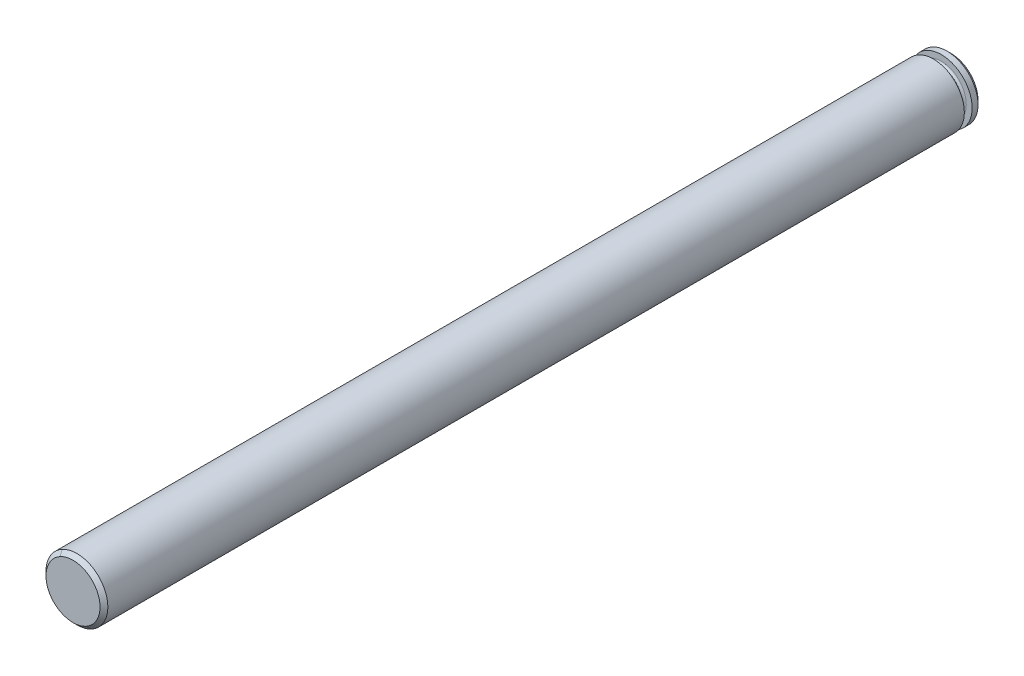
ISO-10303-21;
HEADER;
FILE_DESCRIPTION(('STEP AP214'),'2;1');
FILE_NAME('part.step','',(''),(''),'','','');
FILE_SCHEMA(('AUTOMOTIVE_DESIGN { 1 0 10303 214 1 1 1 1 }'));
ENDSEC;
DATA;
#1=APPLICATION_CONTEXT('core data for automotive mechanical design processes');
#2=APPLICATION_PROTOCOL_DEFINITION('international standard','automotive_design',2000,#1);
#3=PRODUCT_CONTEXT('',#1,'mechanical');
#4=PRODUCT('Part','Part','',(#3));
#5=PRODUCT_RELATED_PRODUCT_CATEGORY('part','',(#4));
#6=PRODUCT_DEFINITION_FORMATION('','',#4);
#7=PRODUCT_DEFINITION_CONTEXT('part definition',#1,'design');
#8=PRODUCT_DEFINITION('design','',#6,#7);
#9=PRODUCT_DEFINITION_SHAPE('','',#8);
#10=(LENGTH_UNIT() NAMED_UNIT(*) SI_UNIT(.MILLI.,.METRE.));
#11=(NAMED_UNIT(*) PLANE_ANGLE_UNIT() SI_UNIT($,.RADIAN.));
#12=(NAMED_UNIT(*) SI_UNIT($,.STERADIAN.) SOLID_ANGLE_UNIT());
#13=UNCERTAINTY_MEASURE_WITH_UNIT(LENGTH_MEASURE(1.E-05),#10,'distance_accuracy_value','');
#14=(GEOMETRIC_REPRESENTATION_CONTEXT(3) GLOBAL_UNCERTAINTY_ASSIGNED_CONTEXT((#13)) GLOBAL_UNIT_ASSIGNED_CONTEXT((#10,
#11,#12)) REPRESENTATION_CONTEXT('',''));
#15=CARTESIAN_POINT('',(0.,0.,0.));
#16=DIRECTION('',(0.,0.,1.));
#17=DIRECTION('',(1.,0.,0.));
#18=AXIS2_PLACEMENT_3D('',#15,#16,#17);
#19=CARTESIAN_POINT('',(0.,0.,0.));
#20=DIRECTION('',(0.,0.,1.));
#21=DIRECTION('',(1.,0.,0.));
#22=AXIS2_PLACEMENT_3D('',#19,#20,#21);
#23=PLANE('',#22);
#24=CARTESIAN_POINT('',(0.,-3.11706690820228E-13,-2.03114434993434E-12));
#25=DIRECTION('',(0.,1.56070185795301E-12,1.));
#26=DIRECTION('',(0.,-1.,1.56070185795301E-12));
#27=AXIS2_PLACEMENT_3D('',#24,#25,#26);
#28=CIRCLE('',#27,1.38499999999371);
#29=CARTESIAN_POINT('',(0.664003718670854,-1.21545220458804,0.));
#30=VERTEX_POINT('',#29);
#31=CARTESIAN_POINT('',(-0.664004370953871,1.21545184820934,-2.94373181587172E-11));
#32=VERTEX_POINT('',#31);
#33=EDGE_CURVE('E79',#30,#32,#28,.T.);
#34=ORIENTED_EDGE('',*,*,#33,.F.);
#35=CARTESIAN_POINT('',(0.,0.,0.));
#36=DIRECTION('',(0.,0.,1.));
#37=DIRECTION('',(1.,0.,0.));
#38=AXIS2_PLACEMENT_3D('',#35,#36,#37);
#39=CIRCLE('',#38,1.38500000003969);
#40=EDGE_CURVE('E68',#32,#30,#39,.T.);
#41=ORIENTED_EDGE('',*,*,#40,.F.);
#42=EDGE_LOOP('',(#34,#41));
#43=FACE_BOUND('',#42,.T.);
#44=ADVANCED_FACE('F16',(#43),#23,.F.);
#45=CARTESIAN_POINT('',(0.,0.,0.199999999892951));
#46=DIRECTION('',(0.,0.,1.));
#47=DIRECTION('',(1.,0.,0.));
#48=AXIS2_PLACEMENT_3D('',#45,#46,#47);
#49=CONICAL_SURFACE('',#48,1.58499999989036,0.785398163291734);
#50=CARTESIAN_POINT('',(0.759889478683472,-1.39096836059171,0.200000000063368));
#51=CARTESIAN_POINT('',(0.755894234761556,-1.38365518957146,0.191666666739275));
#52=CARTESIAN_POINT('',(0.75189899133004,-1.37634201829552,0.18333333340446));
#53=CARTESIAN_POINT('',(0.743908505448206,-1.3617156752076,0.166666666734832));
#54=CARTESIAN_POINT('',(0.739913262997888,-1.35440250339562,0.158333333400018));
#55=CARTESIAN_POINT('',(0.731922779065035,-1.3397761591857,0.141666666723012));
#56=CARTESIAN_POINT('',(0.727927537582499,-1.33246298678775,0.13333333338082));
#57=CARTESIAN_POINT('',(0.719937055610875,-1.31783664151221,0.116666666698712));
#58=CARTESIAN_POINT('',(0.715941815121786,-1.31052346863462,0.108333333358796));
#59=CARTESIAN_POINT('',(0.707951335126436,-1.29589712230343,0.0916666666956885));
#60=CARTESIAN_POINT('',(0.703956095620175,-1.28858394884984,0.083333333372498));
#61=CARTESIAN_POINT('',(0.695965617573733,-1.27395760142803,0.0666666666920793));
#62=CARTESIAN_POINT('',(0.691970379033551,-1.26664442745981,0.0583333333348512));
#63=CARTESIAN_POINT('',(0.68397990294874,-1.25201807897016,0.0416666666510874));
#64=CARTESIAN_POINT('',(0.67998466540411,-1.24470490444873,0.0333333333245516));
#65=CARTESIAN_POINT('',(0.671994191298251,-1.23007855488865,0.0166666666714801));
#66=CARTESIAN_POINT('',(0.667998954737021,-1.22276537985001,0.00833333334494439));
#67=CARTESIAN_POINT('',(0.664003718659898,-1.21545220456798,0.));
#68=B_SPLINE_CURVE_WITH_KNOTS('',3,(#50,#51,#52,#53,#54,#55,#56,#57,#58,#59,#60,#61,#62,#63,#64,
#65,#66,#67),.UNSPECIFIED.,.F.,.F.,(4,2,2,2,2,2,2,2,4),(0.,0.0353553390298724,0.07071067805974,
0.106066017211865,0.141421356241723,0.176776695308849,0.212132034423687,0.247487373490804,
0.282842712520643),.UNSPECIFIED.);
#69=CARTESIAN_POINT('',(0.759889478685623,-1.39096836059565,0.200000000015841));
#70=VERTEX_POINT('',#69);
#71=EDGE_CURVE('E73',#70,#30,#68,.T.);
#72=ORIENTED_EDGE('',*,*,#71,.F.);
#73=CARTESIAN_POINT('',(0.,0.,0.199999999999999));
#74=DIRECTION('',(0.,0.,1.));
#75=DIRECTION('',(1.,0.,0.));
#76=AXIS2_PLACEMENT_3D('',#73,#74,#75);
#77=CIRCLE('',#76,1.585);
#78=CARTESIAN_POINT('',(-0.759889478689931,1.39096836060383,0.20000000001587));
#79=VERTEX_POINT('',#78);
#80=EDGE_CURVE('E113',#79,#70,#77,.T.);
#81=ORIENTED_EDGE('',*,*,#80,.F.);
#82=DIRECTION('',(0.339005049431141,-0.620544580558992,-0.707106781185878));
#83=VECTOR('',#82,1.);
#84=CARTESIAN_POINT('',(-239234.007774535,437914.913830951,498999.999998572));
#85=LINE('',#84,#83);
#86=EDGE_CURVE('E76',#32,#79,#85,.F.);
#87=ORIENTED_EDGE('',*,*,#86,.F.);
#88=ORIENTED_EDGE('',*,*,#40,.T.);
#89=EDGE_LOOP('',(#72,#81,#87,#88));
#90=FACE_BOUND('',#89,.T.);
#91=ADVANCED_FACE('F71',(#90),#49,.T.);
#92=CARTESIAN_POINT('',(0.,0.,0.200000000061158));
#93=DIRECTION('',(0.,1.56070185795301E-12,1.));
#94=DIRECTION('',(0.,-1.,1.56070185795301E-12));
#95=AXIS2_PLACEMENT_3D('',#92,#93,#94);
#96=CONICAL_SURFACE('',#95,1.58499999999402,0.785398163240245);
#97=ORIENTED_EDGE('',*,*,#86,.T.);
#98=CARTESIAN_POINT('',(0.,0.,0.199999999999999));
#99=DIRECTION('',(0.,0.,1.));
#100=DIRECTION('',(1.,0.,0.));
#101=AXIS2_PLACEMENT_3D('',#98,#99,#100);
#102=CIRCLE('',#101,1.585);
#103=EDGE_CURVE('E85',#70,#79,#102,.T.);
#104=ORIENTED_EDGE('',*,*,#103,.F.);
#105=ORIENTED_EDGE('',*,*,#71,.T.);
#106=ORIENTED_EDGE('',*,*,#33,.T.);
#107=EDGE_LOOP('',(#97,#104,#105,#106));
#108=FACE_BOUND('',#107,.T.);
#109=ADVANCED_FACE('F83',(#108),#96,.T.);
#110=CARTESIAN_POINT('',(0.,0.,22.5));
#111=DIRECTION('',(0.,0.,1.));
#112=DIRECTION('',(1.,0.,0.));
#113=AXIS2_PLACEMENT_3D('',#110,#111,#112);
#114=CYLINDRICAL_SURFACE('',#113,1.585);
#115=CARTESIAN_POINT('',(0.,0.,0.5));
#116=DIRECTION('',(0.,0.,1.));
#117=DIRECTION('',(1.,0.,0.));
#118=AXIS2_PLACEMENT_3D('',#115,#116,#117);
#119=CIRCLE('',#118,1.585);
#120=CARTESIAN_POINT('',(1.585,0.,0.5));
#121=VERTEX_POINT('',#120);
#122=EDGE_CURVE('E116',#121,#121,#119,.T.);
#123=ORIENTED_EDGE('',*,*,#122,.F.);
#124=EDGE_LOOP('',(#123));
#125=FACE_BOUND('',#124,.T.);
#126=ORIENTED_EDGE('',*,*,#103,.T.);
#127=ORIENTED_EDGE('',*,*,#80,.T.);
#128=EDGE_LOOP('',(#126,#127));
#129=FACE_BOUND('',#128,.T.);
#130=ADVANCED_FACE('F105',(#125,#129),#114,.T.);
#131=CARTESIAN_POINT('',(0.,0.,0.5));
#132=DIRECTION('',(0.,0.,1.));
#133=DIRECTION('',(1.,0.,0.));
#134=AXIS2_PLACEMENT_3D('',#131,#132,#133);
#135=PLANE('',#134);
#136=CARTESIAN_POINT('',(1.285,0.,0.5));
#137=CARTESIAN_POINT('',(1.28498799707352,0.0147050297417649,0.500000001097084));
#138=CARTESIAN_POINT('',(1.28472756027749,0.0294098427772398,0.500000002221303));
#139=CARTESIAN_POINT('',(1.28371055856216,0.0588011581089547,0.500000003433274));
#140=CARTESIAN_POINT('',(1.28295403222613,0.0734876617402126,0.500000003521108));
#141=CARTESIAN_POINT('',(1.28094564720276,0.102825922414616,0.500000001570142));
#142=CARTESIAN_POINT('',(1.27969381724666,0.117477681423621,0.499999999531465));
#143=CARTESIAN_POINT('',(1.27669656751072,0.146729988725546,0.500000000601546));
#144=CARTESIAN_POINT('',(1.27495116660375,0.161330538954952,0.500000003710105));
#145=CARTESIAN_POINT('',(1.27096797454155,0.190464332830054,0.500000026378864));
#146=CARTESIAN_POINT('',(1.2687301924799,0.204997577713725,0.500000045938759));
#147=CARTESIAN_POINT('',(1.265008400323,0.226734315607106,0.500000105847074));
#148=CARTESIAN_POINT('',(1.26370692445435,0.233969496167106,0.500000130911946));
#149=CARTESIAN_POINT('',(1.26098284445311,0.248396287684475,0.500000187735406));
#150=CARTESIAN_POINT('',(1.25956058584783,0.25558796381526,0.50000021947526));
#151=CARTESIAN_POINT('',(1.25510290491829,0.277122433875555,0.500000306479361));
#152=CARTESIAN_POINT('',(1.25187632855789,0.291426131542391,0.500000353536226));
#153=CARTESIAN_POINT('',(1.24492164087692,0.319909057486411,0.50000040459447));
#154=CARTESIAN_POINT('',(1.24119358639828,0.334088299676714,0.500000408600725));
#155=CARTESIAN_POINT('',(1.23323758037846,0.36230346491391,0.500000371253394));
#156=CARTESIAN_POINT('',(1.22900970379884,0.376339409109974,0.500000329906602));
#157=CARTESIAN_POINT('',(1.22006916979096,0.404253538111248,0.500000220818375));
#158=CARTESIAN_POINT('',(1.21535660283347,0.418131751822809,0.500000153081859));
#159=CARTESIAN_POINT('',(1.20541837986792,0.445699326975706,0.500000047398954));
#160=CARTESIAN_POINT('',(1.20019283843829,0.459388729814437,0.50000000944593));
#161=CARTESIAN_POINT('',(1.19176936577519,0.480565316503003,0.499999994751669));
#162=CARTESIAN_POINT('',(1.18870231628079,0.4881053361269,0.499999998303808));
#163=CARTESIAN_POINT('',(1.17896525842148,0.511432830093821,0.500000004504551));
#164=CARTESIAN_POINT('',(1.17206033511395,0.527123450995526,0.500000001813609));
#165=CARTESIAN_POINT('',(1.15694901736774,0.559688028479315,0.500000025702216));
#166=CARTESIAN_POINT('',(1.14868129710778,0.576533480979396,0.500000055075333));
#167=CARTESIAN_POINT('',(1.12982843058922,0.612907447430353,0.500000147930819));
#168=CARTESIAN_POINT('',(1.1190965897236,0.632360297430498,0.50000021668838));
#169=CARTESIAN_POINT('',(1.1003428075993,0.664337327037302,0.500000320167498));
#170=CARTESIAN_POINT('',(1.09259854036268,0.677025166352065,0.500000358624801));
#171=CARTESIAN_POINT('',(1.08116782447637,0.695027333369588,0.500000392414278));
#172=CARTESIAN_POINT('',(1.07766151402148,0.700456467027864,0.500000399835571));
#173=CARTESIAN_POINT('',(1.06975072786448,0.712501063577201,0.500000410191192));
#174=CARTESIAN_POINT('',(1.06532495991501,0.719102544414565,0.500000411703123));
#175=CARTESIAN_POINT('',(1.05186367807091,0.738779684637734,0.500000408952618));
#176=CARTESIAN_POINT('',(1.04264325129584,0.751729524769693,0.500000397405825));
#177=CARTESIAN_POINT('',(1.0237237971286,0.777272238566719,0.500000354502346));
#178=CARTESIAN_POINT('',(1.01402481890427,0.789865148695417,0.500000323147692));
#179=CARTESIAN_POINT('',(0.994160925856835,0.814675475925264,0.500000249669426));
#180=CARTESIAN_POINT('',(0.983996066984227,0.826892937823449,0.500000207547105));
#181=CARTESIAN_POINT('',(0.963219815835392,0.850939444749202,0.50000012373105));
#182=CARTESIAN_POINT('',(0.952608484941941,0.862768542775068,0.500000082037258));
#183=CARTESIAN_POINT('',(0.930936971665197,0.886004602354071,0.500000022478194));
#184=CARTESIAN_POINT('',(0.919876858789827,0.897411628758916,0.500000004609247));
#185=CARTESIAN_POINT('',(0.902287474192605,0.914963377768376,0.499999997399253));
#186=CARTESIAN_POINT('',(0.895883984541143,0.921235183839417,0.499999999020036));
#187=CARTESIAN_POINT('',(0.877139810123166,0.939229941536692,0.500000002114661));
#188=CARTESIAN_POINT('',(0.864636695142938,0.950784800500011,0.500000002146594));
#189=CARTESIAN_POINT('',(0.838409502858379,0.974077560857547,0.500000027490383));
#190=CARTESIAN_POINT('',(0.82465738859823,0.985783966924233,0.500000054337281));
#191=CARTESIAN_POINT('',(0.806971293272475,1.00020980864941,0.500000105957419));
#192=CARTESIAN_POINT('',(0.803258954371275,1.00320366753588,0.500000117720039));
#193=CARTESIAN_POINT('',(0.785883097071961,1.01705617972917,0.500000174734945));
#194=CARTESIAN_POINT('',(0.772011251181357,1.02765612949908,0.500000225857636));
#195=CARTESIAN_POINT('',(0.74593901159483,1.04674092849131,0.500000314262464));
#196=CARTESIAN_POINT('',(0.733797018630423,1.05530581914133,0.500000352472163));
#197=CARTESIAN_POINT('',(0.71616821861681,1.06727873643727,0.500000385927777));
#198=CARTESIAN_POINT('',(0.71080114934286,1.07086377428436,0.50000039325061));
#199=CARTESIAN_POINT('',(0.698764503312622,1.07877083089389,0.500000403504732));
#200=CARTESIAN_POINT('',(0.692080868958041,1.08307145572291,0.500000405027989));
#201=CARTESIAN_POINT('',(0.671911693256627,1.09578348448883,0.500000402410339));
#202=CARTESIAN_POINT('',(0.658306445664472,1.10400602325343,0.500000391083914));
#203=CARTESIAN_POINT('',(0.630798385728783,1.1199331872925,0.500000348981055));
#204=CARTESIAN_POINT('',(0.61689560360253,1.12763786483438,0.500000318206588));
#205=CARTESIAN_POINT('',(0.588812000251104,1.14251866430475,0.500000245749123));
#206=CARTESIAN_POINT('',(0.574631212089149,1.14969484860977,0.500000204067416));
#207=CARTESIAN_POINT('',(0.546012476457049,1.16350955026776,0.500000122155963));
#208=CARTESIAN_POINT('',(0.53157456405419,1.17014814026451,0.50000008192602));
#209=CARTESIAN_POINT('',(0.502460501679691,1.18287428152431,0.500000021012117));
#210=CARTESIAN_POINT('',(0.48778438837333,1.18896191666248,0.500000000325176));
#211=CARTESIAN_POINT('',(0.459322608293963,1.20015982313465,0.4999999996991));
#212=CARTESIAN_POINT('',(0.445552259893445,1.20530913088757,0.500000016833255));
#213=CARTESIAN_POINT('',(0.417852372091183,1.21515070985214,0.500000044735234));
#214=CARTESIAN_POINT('',(0.403922866072238,1.21984307500886,0.500000055504369));
#215=CARTESIAN_POINT('',(0.375917914392371,1.22876153525919,0.500000055659529));
#216=CARTESIAN_POINT('',(0.361842493133755,1.23298770698374,0.500000045049074));
#217=CARTESIAN_POINT('',(0.333561596748888,1.24097298563415,0.500000020401565));
#218=CARTESIAN_POINT('',(0.319356137860121,1.24473215004245,0.500000006364934));
#219=CARTESIAN_POINT('',(0.290828042958565,1.25177044867789,0.499999993872397));
#220=CARTESIAN_POINT('',(0.276505416625777,1.25504962214577,0.499999995415217));
#221=CARTESIAN_POINT('',(0.254950385404767,1.2596309695535,0.500000115148755));
#222=CARTESIAN_POINT('',(0.247753530661562,1.26110184911905,0.500000174629749));
#223=CARTESIAN_POINT('',(0.237831885132774,1.26301840536092,0.500000225576079));
#224=CARTESIAN_POINT('',(0.235120035591347,1.26353086297671,0.500000236321019));
#225=CARTESIAN_POINT('',(0.221022659694485,1.26614042657237,0.500000275518583));
#226=CARTESIAN_POINT('',(0.209606038756417,1.26806956265281,0.500000250870432));
#227=CARTESIAN_POINT('',(0.178743531471963,1.27285720160833,0.500000189827051));
#228=CARTESIAN_POINT('',(0.159251578261061,1.27542538135917,0.500000157229964));
#229=CARTESIAN_POINT('',(0.133573545870706,1.27820411908283,0.500000111761689));
#230=CARTESIAN_POINT('',(0.127429433155902,1.27882369413722,0.500000100692938));
#231=CARTESIAN_POINT('',(0.104590990899455,1.28096060739732,0.50000006294544));
#232=CARTESIAN_POINT('',(0.0878691011349143,1.28219590114673,0.500000042040274));
#233=CARTESIAN_POINT('',(0.0554771002968265,1.28395311962118,0.500000013724783));
#234=CARTESIAN_POINT('',(0.0398091850313694,1.2845161505283,0.500000005526469));
#235=CARTESIAN_POINT('',(0.0160921040422124,1.28493727607514,0.500000000543382));
#236=CARTESIAN_POINT('',(0.00804612832851601,1.28500509148009,0.500000000145688));
#237=CARTESIAN_POINT('',(-0.0146963837234354,1.28499070032914,0.499999999733898));
#238=CARTESIAN_POINT('',(-0.029393276594543,1.28473817152102,0.500000000308526));
#239=CARTESIAN_POINT('',(-0.0587687697318173,1.28373286110426,0.500000000359284));
#240=CARTESIAN_POINT('',(-0.0734473710772349,1.28298011056099,0.499999999835483));
#241=CARTESIAN_POINT('',(-0.102770132257111,1.28097903324434,0.500000000309181));
#242=CARTESIAN_POINT('',(-0.117414293651919,1.27973072937542,0.500000001306611));
#243=CARTESIAN_POINT('',(-0.146651454388751,1.27673922177249,0.500000011600579));
#244=CARTESIAN_POINT('',(-0.161244455269162,1.27499603305105,0.500000020896866));
#245=CARTESIAN_POINT('',(-0.190363104823107,1.27101630469696,0.500000056890947));
#246=CARTESIAN_POINT('',(-0.204888754466916,1.2687797721942,0.500000083588491));
#247=CARTESIAN_POINT('',(-0.226613920533461,1.26505890435128,0.500000151687464));
#248=CARTESIAN_POINT('',(-0.233845216717645,1.263757577668,0.500000179063286));
#249=CARTESIAN_POINT('',(-0.24827244429538,1.26103224222896,0.500000238601334));
#250=CARTESIAN_POINT('',(-0.255468414160564,1.25960843733242,0.500000270755667));
#251=CARTESIAN_POINT('',(-0.277015529133428,1.25514618140374,0.500000356644486));
#252=CARTESIAN_POINT('',(-0.29132756543794,1.25191660192182,0.500000399814742));
#253=CARTESIAN_POINT('',(-0.319826809824331,1.244955806271,0.500000441162701));
#254=CARTESIAN_POINT('',(-0.334014034253897,1.24122465687149,0.500000439346389));
#255=CARTESIAN_POINT('',(-0.362244835909076,1.23326243503202,0.500000391109541));
#256=CARTESIAN_POINT('',(-0.37628843693921,1.22903144694503,0.500000344696523));
#257=CARTESIAN_POINT('',(-0.404217588771221,1.22008470769989,0.500000227653526));
#258=CARTESIAN_POINT('',(-0.418103171238583,1.215369055634,0.50000015702849));
#259=CARTESIAN_POINT('',(-0.445685160698457,1.20542455846413,0.500000047982143));
#260=CARTESIAN_POINT('',(-0.459381612217362,1.20019583658372,0.50000000955312));
#261=CARTESIAN_POINT('',(-0.4805580059167,1.19177218110158,0.499999994700014));
#262=CARTESIAN_POINT('',(-0.488090806362517,1.18870817693157,0.499999998287832));
#263=CARTESIAN_POINT('',(-0.511412295003634,1.17897416960181,0.500000004552065));
#264=CARTESIAN_POINT('',(-0.527104051177037,1.17206904478797,0.500000001817467));
#265=CARTESIAN_POINT('',(-0.559675966420853,1.1569549267687,0.500000025665269));
#266=CARTESIAN_POINT('',(-0.576527518709203,1.14868438433371,0.500000055055581));
#267=CARTESIAN_POINT('',(-0.612907449454256,1.12982843315874,0.500000147936186));
#268=CARTESIAN_POINT('',(-0.632360297950585,1.11909659021359,0.500000216689513));
#269=CARTESIAN_POINT('',(-0.664337326890402,1.10034280715302,0.50000032016674));
#270=CARTESIAN_POINT('',(-0.677025166415407,1.09259854023377,0.500000358624674));
#271=CARTESIAN_POINT('',(-0.69502733344989,1.08116782446387,0.500000392414333));
#272=CARTESIAN_POINT('',(-0.700456467063945,1.07766151400756,0.500000399835586));
#273=CARTESIAN_POINT('',(-0.712501063569344,1.06975072785761,0.500000410191173));
#274=CARTESIAN_POINT('',(-0.719102544410697,1.06532495992376,0.500000411703121));
#275=CARTESIAN_POINT('',(-0.738779684645431,1.05186367805343,0.500000408952621));
#276=CARTESIAN_POINT('',(-0.751729524784562,1.04264325116338,0.500000397405763));
#277=CARTESIAN_POINT('',(-0.777272238551843,1.02372379726107,0.500000354502407));
#278=CARTESIAN_POINT('',(-0.78986514864363,1.01402481941658,0.50000032314794));
#279=CARTESIAN_POINT('',(-0.814675475977047,0.994160925344602,0.500000249669178));
#280=CARTESIAN_POINT('',(-0.826892938015693,0.983996065067809,0.500000207546173));
#281=CARTESIAN_POINT('',(-0.850939444556992,0.963219817751568,0.500000123731981));
#282=CARTESIAN_POINT('',(-0.862768542058034,0.952608492093986,0.500000082040735));
#283=CARTESIAN_POINT('',(-0.886004603071002,0.930936964514267,0.500000022474718));
#284=CARTESIAN_POINT('',(-0.897411631434253,0.919876832103874,0.500000004596273));
#285=CARTESIAN_POINT('',(-0.914963376257843,0.90228748925102,0.499999997406574));
#286=CARTESIAN_POINT('',(-0.921235179343113,0.895884029373497,0.499999999041831));
#287=CARTESIAN_POINT('',(-0.939229950068604,0.877139724994844,0.500000002073273));
#288=CARTESIAN_POINT('',(-0.950784844537082,0.864636255858907,0.500000001933027));
#289=CARTESIAN_POINT('',(-0.974077514142019,0.838409968823384,0.500000027716919));
#290=CARTESIAN_POINT('',(-0.985783783996664,0.824659213259777,0.500000055224371));
#291=CARTESIAN_POINT('',(-1.01124048652332,0.79344570224752,0.500000144335991));
#292=CARTESIAN_POINT('',(-1.02483920835345,0.775858643653458,0.500000212343926));
#293=CARTESIAN_POINT('',(-1.04674126688915,0.745939135411321,0.500000314575005));
#294=CARTESIAN_POINT('',(-1.05530587632213,0.733797039578453,0.500000352525011));
#295=CARTESIAN_POINT('',(-1.06727871157721,0.716168209542161,0.500000385904817));
#296=CARTESIAN_POINT('',(-1.07086376686238,0.71080114663796,0.500000393243731));
#297=CARTESIAN_POINT('',(-1.07877084002708,0.698764506652462,0.500000403513202));
#298=CARTESIAN_POINT('',(-1.08307145880248,0.692080870080987,0.500000405030975));
#299=CARTESIAN_POINT('',(-1.09578347833052,0.671911691011117,0.500000402404368));
#300=CARTESIAN_POINT('',(-1.10400602283056,0.658306445548428,0.500000391081963));
#301=CARTESIAN_POINT('',(-1.11993318771561,0.630798385844956,0.500000348983007));
#302=CARTESIAN_POINT('',(-1.12763786036913,0.616895601821862,0.500000318208422));
#303=CARTESIAN_POINT('',(-1.14251866876985,0.588812002031709,0.500000245747289));
#304=CARTESIAN_POINT('',(-1.14969486689138,0.574631219326996,0.500000204062031));
#305=CARTESIAN_POINT('',(-1.16350953198897,0.5460124692203,0.500000122161347));
#306=CARTESIAN_POINT('',(-1.17014807161749,0.53157453688904,0.500000081945724));
#307=CARTESIAN_POINT('',(-1.18287435016109,0.502460528840765,0.500000020992416));
#308=CARTESIAN_POINT('',(-1.188962172915,0.487784489774668,0.500000000251761));
#309=CARTESIAN_POINT('',(-1.20014972295959,0.459347584714749,0.49999999976746));
#310=CARTESIAN_POINT('',(-1.20528940347673,0.445602397074759,0.500000017014584));
#311=CARTESIAN_POINT('',(-1.21511197254482,0.417951876164128,0.500000048365985));
#312=CARTESIAN_POINT('',(-1.21979492429396,0.404046565348515,0.500000062470699));
#313=CARTESIAN_POINT('',(-1.2286948216725,0.376089183541786,0.500000070682661));
#314=CARTESIAN_POINT('',(-1.23291181451615,0.362037127578148,0.500000064791938));
#315=CARTESIAN_POINT('',(-1.24087932147218,0.333802269502494,0.500000042534345));
#316=CARTESIAN_POINT('',(-1.24462986554729,0.319619475851454,0.500000026168148));
#317=CARTESIAN_POINT('',(-1.2516494824195,0.291135727979141,0.499999994513787));
#318=CARTESIAN_POINT('',(-1.25491856827098,0.276834776972725,0.499999979225594));
#319=CARTESIAN_POINT('',(-1.25948897805758,0.255312871805513,0.500000036469864));
#320=CARTESIAN_POINT('',(-1.26095693575592,0.248127022311248,0.500000068915401));
#321=CARTESIAN_POINT('',(-1.26275602672824,0.238780858021017,0.500000086737727));
#322=CARTESIAN_POINT('',(-1.26316159442588,0.236634933863604,0.500000089167814));
#323=CARTESIAN_POINT('',(-1.26561013626145,0.223475751286302,0.50000009874565));
#324=CARTESIAN_POINT('',(-1.26749963882529,0.212434074180855,0.500000083943431));
#325=CARTESIAN_POINT('',(-1.2734219549845,0.174883864753684,0.500000040886966));
#326=CARTESIAN_POINT('',(-1.27677242109831,0.148263148622219,0.500000022630324));
#327=CARTESIAN_POINT('',(-1.28059086794663,0.107697613592006,0.500000006075712));
#328=CARTESIAN_POINT('',(-1.28167037072618,0.0938065278449376,0.500000002403016));
#329=CARTESIAN_POINT('',(-1.28346219638524,0.0646959263578179,0.499999999082603));
#330=CARTESIAN_POINT('',(-1.28413075448808,0.0494736332222034,0.499999999843297));
#331=CARTESIAN_POINT('',(-1.28483800434566,0.02283208447089,0.500000000760982));
#332=CARTESIAN_POINT('',(-1.28499255798055,0.0114157929006724,0.500000001021491));
#333=CARTESIAN_POINT('',(-1.285,0.,0.5));
#334=B_SPLINE_CURVE_WITH_KNOTS('',3,(#136,#137,#138,#139,#140,#141,#142,#143,#144,#145,#146,
#147,#148,#149,#150,#151,#152,#153,#154,#155,#156,#157,#158,#159,#160,#161,#162,#163,#164,#165,
#166,#167,#168,#169,#170,#171,#172,#173,#174,#175,#176,#177,#178,#179,#180,#181,#182,#183,#184,
#185,#186,#187,#188,#189,#190,#191,#192,#193,#194,#195,#196,#197,#198,#199,#200,#201,#202,#203,
#204,#205,#206,#207,#208,#209,#210,#211,#212,#213,#214,#215,#216,#217,#218,#219,#220,#221,#222,
#223,#224,#225,#226,#227,#228,#229,#230,#231,#232,#233,#234,#235,#236,#237,#238,#239,#240,#241,
#242,#243,#244,#245,#246,#247,#248,#249,#250,#251,#252,#253,#254,#255,#256,#257,#258,#259,#260,
#261,#262,#263,#264,#265,#266,#267,#268,#269,#270,#271,#272,#273,#274,#275,#276,#277,#278,#279,
#280,#281,#282,#283,#284,#285,#286,#287,#288,#289,#290,#291,#292,#293,#294,#295,#296,#297,#298,
#299,#300,#301,#302,#303,#304,#305,#306,#307,#308,#309,#310,#311,#312,#313,#314,#315,#316,#317,
#318,#319,#320,#321,#322,#323,#324,#325,#326,#327,#328,#329,#330,#331,#332,#333),.UNSPECIFIED.,
.F.,.F.,(4,2,2,2,2,2,2,2,2,2,2,2,2,2,2,2,2,2,2,2,2,2,2,2,2,2,2,2,2,2,2,2,2,2,2,2,2,2,2,2,2,2,2,
2,2,2,2,2,2,2,2,2,2,2,2,2,2,2,2,2,2,2,2,2,2,2,2,2,2,2,2,2,2,2,2,2,2,2,2,2,2,2,2,2,2,2,2,2,2,2,2,
2,2,2,2,2,2,2,4),(0.,0.0441129853350718,0.0882225401989148,0.132329536759885,0.176434847011096,
0.220539342768247,0.242592342744173,0.264584253177065,0.308563627261506,0.352538020531854,
0.396505827024598,0.440465441470086,0.484415259301787,0.508834577110349,0.560248084026298,
0.616526165604483,0.68314382958301,0.727728345521007,0.747116512571211,0.770958577992412,
0.818637452866892,0.866311439227278,0.913979715049596,0.961641458523542,1.00929584805422,
1.03618461998408,1.08724544045702,1.14140700208517,1.15571436930153,1.20807171678635,
1.25263892662141,1.2720011475095,1.29584309384371,1.34352177924415,1.3911956452148,
1.43886387532842,1.48652565336673,1.53418016332215,1.57827705283129,1.62236485701845,
1.6664454034025,1.71052051866469,1.75459202863394,1.77662775751291,1.78490720032038,
1.81963819526367,1.87859444759792,1.89712004977135,1.94740798044393,1.99443116937202,
2.01856898324272,2.0626570912625,2.106742461525,2.15082579440118,2.19490779013077,
2.23898914882072,2.26103059698572,2.2830360429314,2.32704180741983,2.37104171961488,
2.41503421694574,2.45901773759028,2.50299072048376,2.52738653892047,2.57880340092469,
2.63510162143665,2.7017192855929,2.74630380145979,2.76569196840331,2.78953403382452,
2.837212908699,2.88488689505939,2.93255517088171,2.98021691435566,3.02787130388634,
3.05476007581202,3.10582089628554,3.15998245791727,3.22664332363936,3.27121053349205,
3.2905727544066,3.31441470074084,3.3620933861413,3.40976725211197,3.45743548222559,
3.50509726026391,3.55275177021931,3.59676784205199,3.64077781465348,3.68478332375451,
3.72878600466229,3.77278749225065,3.79478905665089,3.80134074187228,3.83494412366736,
3.91537312384318,3.95716656001583,4.00286740138245,4.03711513705482),.UNSPECIFIED.);
#335=CARTESIAN_POINT('',(-1.285,0.,0.5));
#336=VERTEX_POINT('',#335);
#337=CARTESIAN_POINT('',(1.285,0.,0.5));
#338=VERTEX_POINT('',#337);
#339=EDGE_CURVE('E119',#336,#338,#334,.F.);
#340=ORIENTED_EDGE('',*,*,#339,.T.);
#341=CARTESIAN_POINT('',(0.,0.,0.5));
#342=DIRECTION('',(0.,0.,1.));
#343=DIRECTION('',(-1.,0.,0.));
#344=AXIS2_PLACEMENT_3D('',#341,#342,#343);
#345=CIRCLE('',#344,1.285);
#346=EDGE_CURVE('E123',#338,#336,#345,.F.);
#347=ORIENTED_EDGE('',*,*,#346,.T.);
#348=EDGE_LOOP('',(#340,#347));
#349=FACE_BOUND('',#348,.T.);
#350=ORIENTED_EDGE('',*,*,#122,.T.);
#351=EDGE_LOOP('',(#350));
#352=FACE_BOUND('',#351,.T.);
#353=ADVANCED_FACE('F178',(#349,#352),#135,.T.);
#354=CARTESIAN_POINT('',(0.,0.,0.6));
#355=DIRECTION('',(0.,0.,1.));
#356=DIRECTION('',(-1.,0.,0.));
#357=AXIS2_PLACEMENT_3D('',#354,#355,#356);
#358=TOROIDAL_SURFACE('',#357,1.285,0.1);
#359=ORIENTED_EDGE('',*,*,#346,.F.);
#360=ORIENTED_EDGE('',*,*,#339,.F.);
#361=EDGE_LOOP('',(#359,#360));
#362=FACE_BOUND('',#361,.T.);
#363=CARTESIAN_POINT('',(0.,0.,0.6));
#364=DIRECTION('',(0.,0.,1.));
#365=DIRECTION('',(1.,0.,0.));
#366=AXIS2_PLACEMENT_3D('',#363,#364,#365);
#367=CIRCLE('',#366,1.185);
#368=CARTESIAN_POINT('',(1.185,0.,0.6));
#369=VERTEX_POINT('',#368);
#370=EDGE_CURVE('E171',#369,#369,#367,.T.);
#371=ORIENTED_EDGE('',*,*,#370,.F.);
#372=EDGE_LOOP('',(#371));
#373=FACE_BOUND('',#372,.T.);
#374=ADVANCED_FACE('F175',(#362,#373),#358,.F.);
#375=CARTESIAN_POINT('',(0.,0.,0.7));
#376=DIRECTION('',(0.,0.,1.));
#377=DIRECTION('',(1.,0.,0.));
#378=AXIS2_PLACEMENT_3D('',#375,#376,#377);
#379=CYLINDRICAL_SURFACE('',#378,1.185);
#380=CARTESIAN_POINT('',(0.,0.,0.8));
#381=DIRECTION('',(0.,0.,1.));
#382=DIRECTION('',(-1.,0.,0.));
#383=AXIS2_PLACEMENT_3D('',#380,#381,#382);
#384=CIRCLE('',#383,1.185);
#385=CARTESIAN_POINT('',(-1.185,0.,0.8));
#386=VERTEX_POINT('',#385);
#387=EDGE_CURVE('E163',#386,#386,#384,.F.);
#388=ORIENTED_EDGE('',*,*,#387,.T.);
#389=EDGE_LOOP('',(#388));
#390=FACE_BOUND('',#389,.T.);
#391=ORIENTED_EDGE('',*,*,#370,.T.);
#392=EDGE_LOOP('',(#391));
#393=FACE_BOUND('',#392,.T.);
#394=ADVANCED_FACE('F149',(#390,#393),#379,.T.);
#395=CARTESIAN_POINT('',(0.,0.,0.8));
#396=DIRECTION('',(0.,0.,1.));
#397=DIRECTION('',(-1.,0.,0.));
#398=AXIS2_PLACEMENT_3D('',#395,#396,#397);
#399=TOROIDAL_SURFACE('',#398,1.285,0.1);
#400=ORIENTED_EDGE('',*,*,#387,.F.);
#401=EDGE_LOOP('',(#400));
#402=FACE_BOUND('',#401,.T.);
#403=CARTESIAN_POINT('',(0.,0.,0.9));
#404=DIRECTION('',(0.,0.,-1.));
#405=DIRECTION('',(1.,0.,0.));
#406=AXIS2_PLACEMENT_3D('',#403,#404,#405);
#407=CIRCLE('',#406,1.285);
#408=CARTESIAN_POINT('',(1.285,0.,0.9));
#409=VERTEX_POINT('',#408);
#410=CARTESIAN_POINT('',(-1.285,0.,0.9));
#411=VERTEX_POINT('',#410);
#412=EDGE_CURVE('E159',#409,#411,#407,.T.);
#413=ORIENTED_EDGE('',*,*,#412,.T.);
#414=CARTESIAN_POINT('',(-1.285,0.,0.9));
#415=CARTESIAN_POINT('',(-1.28498604396833,0.0179374024178484,0.899999997869807));
#416=CARTESIAN_POINT('',(-1.28459958677738,0.0358742136803566,0.899999996242543));
#417=CARTESIAN_POINT('',(-1.28308523096232,0.0717156061434968,0.899999994121383));
#418=CARTESIAN_POINT('',(-1.28195737026677,0.0896201889458838,0.899999993627428));
#419=CARTESIAN_POINT('',(-1.27896381119708,0.125367380439808,0.899999993900144));
#420=CARTESIAN_POINT('',(-1.27709813501605,0.143209990979155,0.899999994666776));
#421=CARTESIAN_POINT('',(-1.27262292667927,0.178800398971072,0.900000003688988));
#422=CARTESIAN_POINT('',(-1.27001340121879,0.196548197275566,0.900000011944499));
#423=CARTESIAN_POINT('',(-1.26366732337729,0.234455996503967,0.899999972122882));
#424=CARTESIAN_POINT('',(-1.25982302618235,0.254598421602253,0.899999915830277));
#425=CARTESIAN_POINT('',(-1.2542895894924,0.279879306100922,0.899999922648013));
#426=CARTESIAN_POINT('',(-1.25310152335335,0.285129419572956,0.899999928321085));
#427=CARTESIAN_POINT('',(-1.24760358094472,0.308740870650165,0.899999951649884));
#428=CARTESIAN_POINT('',(-1.24292514838406,0.327017855150343,0.899999963744218));
#429=CARTESIAN_POINT('',(-1.23198177797785,0.366146321277845,0.899999985462533));
#430=CARTESIAN_POINT('',(-1.22558346790872,0.386960732009777,0.899999994419074));
#431=CARTESIAN_POINT('',(-1.21700592982508,0.412545160031495,0.899999998562896));
#432=CARTESIAN_POINT('',(-1.21531712497266,0.417482939735337,0.899999999041552));
#433=CARTESIAN_POINT('',(-1.20748437570827,0.439948035007361,0.900000000642207));
#434=CARTESIAN_POINT('',(-1.20099855277134,0.45735787286153,0.900000000276177));
#435=CARTESIAN_POINT('',(-1.18711546527519,0.49233331972838,0.899999998746928));
#436=CARTESIAN_POINT('',(-1.17969894947436,0.50989129014769,0.899999997563314));
#437=CARTESIAN_POINT('',(-1.16964194731961,0.532326968787123,0.899999976052124));
#438=CARTESIAN_POINT('',(-1.16734697162724,0.537361318103889,0.899999969905551));
#439=CARTESIAN_POINT('',(-1.15918467643568,0.554963883401433,0.899999944341165));
#440=CARTESIAN_POINT('',(-1.15314556085857,0.56745301336142,0.899999918882328));
#441=CARTESIAN_POINT('',(-1.13816413861504,0.597181792370884,0.899999855897632));
#442=CARTESIAN_POINT('',(-1.12902679197796,0.614323448135574,0.899999817618282));
#443=CARTESIAN_POINT('',(-1.10997729028716,0.648170830376749,0.899999752701668));
#444=CARTESIAN_POINT('',(-1.1000651186184,0.664876547494886,0.899999726064653));
#445=CARTESIAN_POINT('',(-1.0794860543772,0.697816540888533,0.899999694035225));
#446=CARTESIAN_POINT('',(-1.06881916144201,0.714050816937444,0.899999688642822));
#447=CARTESIAN_POINT('',(-1.04675417458433,0.746014235329275,0.899999700741025));
#448=CARTESIAN_POINT('',(-1.03535609564628,0.761743388013943,0.899999718231162));
#449=CARTESIAN_POINT('',(-1.01185013123056,0.792660655003781,0.899999770225455));
#450=CARTESIAN_POINT('',(-0.999742275196859,0.807848791710179,0.899999804728906));
#451=CARTESIAN_POINT('',(-0.97485269117669,0.837661706988195,0.899999878390371));
#452=CARTESIAN_POINT('',(-0.962071005302256,0.852286520666927,0.899999917548095));
#453=CARTESIAN_POINT('',(-0.935822816960085,0.880905341402123,0.899999977141203));
#454=CARTESIAN_POINT('',(-0.922356371690611,0.894899400962161,0.899999997578148));
#455=CARTESIAN_POINT('',(-0.903080991443062,0.914186937026714,0.900000000979604));
#456=CARTESIAN_POINT('',(-0.897487605092213,0.919698918050572,0.899999999011785));
#457=CARTESIAN_POINT('',(-0.875547988017546,0.940918951289185,0.899999985416019));
#458=CARTESIAN_POINT('',(-0.858825543447889,0.956242508634075,0.899999962566861));
#459=CARTESIAN_POINT('',(-0.826911470796269,0.983980418943014,0.89999988637126));
#460=CARTESIAN_POINT('',(-0.811818031858688,0.996508208575904,0.899999837559393));
#461=CARTESIAN_POINT('',(-0.789623734810949,1.01408202875965,0.899999757358126));
#462=CARTESIAN_POINT('',(-0.782747419647687,1.0194132979831,0.899999731381788));
#463=CARTESIAN_POINT('',(-0.760167679408344,1.0365489250622,0.899999654779865));
#464=CARTESIAN_POINT('',(-0.74424041981505,1.04806061426101,0.899999614247348));
#465=CARTESIAN_POINT('',(-0.710478475123388,1.07127808847818,0.89999958970387));
#466=CARTESIAN_POINT('',(-0.692597210371276,1.08291615688322,0.899999610827469));
#467=CARTESIAN_POINT('',(-0.66185451124054,1.10183866756101,0.899999673826981));
#468=CARTESIAN_POINT('',(-0.649139296636749,1.10936185162338,0.899999707329654));
#469=CARTESIAN_POINT('',(-0.62449750267285,1.1233762408023,0.899999761838158));
#470=CARTESIAN_POINT('',(-0.612590395736882,1.12990168725767,0.899999783636018));
#471=CARTESIAN_POINT('',(-0.587910447400777,1.14292254072653,0.899999825823636));
#472=CARTESIAN_POINT('',(-0.575126165456946,1.14939629525191,0.899999846068684));
#473=CARTESIAN_POINT('',(-0.550812929158203,1.1612022282385,0.899999879929202));
#474=CARTESIAN_POINT('',(-0.539306302814364,1.16658055566155,0.899999894036472));
#475=CARTESIAN_POINT('',(-0.50900683509794,1.18019916403201,0.899999927242427));
#476=CARTESIAN_POINT('',(-0.49008877881671,1.18816329896965,0.899999944068427));
#477=CARTESIAN_POINT('',(-0.457953431248537,1.2007995778499,0.899999964022239));
#478=CARTESIAN_POINT('',(-0.44483094269355,1.20571472678374,0.899999969801976));
#479=CARTESIAN_POINT('',(-0.424562450684033,1.21292862282898,0.899999978726644));
#480=CARTESIAN_POINT('',(-0.41747141572415,1.21538227815216,0.899999981848521));
#481=CARTESIAN_POINT('',(-0.40946367798506,1.21808550217134,0.899999978917678));
#482=CARTESIAN_POINT('',(-0.408564698007574,1.21838801960933,0.899999978497284));
#483=CARTESIAN_POINT('',(-0.395526083607216,1.22276043820671,0.899999971567662));
#484=CARTESIAN_POINT('',(-0.383328427971765,1.22665951035126,0.899999954628413));
#485=CARTESIAN_POINT('',(-0.353917515011369,1.2355677572926,0.899999916672676));
#486=CARTESIAN_POINT('',(-0.336649576211235,1.24039714944146,0.899999896735439));
#487=CARTESIAN_POINT('',(-0.301925927956799,1.2493254489002,0.899999861868737));
#488=CARTESIAN_POINT('',(-0.284470215349255,1.25342434392265,0.899999846939356));
#489=CARTESIAN_POINT('',(-0.249401053712615,1.26088098812394,0.899999829303657));
#490=CARTESIAN_POINT('',(-0.231787604485678,1.26423873637306,0.899999826597356));
#491=CARTESIAN_POINT('',(-0.196434999570296,1.27020800205408,0.899999833691321));
#492=CARTESIAN_POINT('',(-0.178695845684246,1.27281953016345,0.899999843491407));
#493=CARTESIAN_POINT('',(-0.143123629988574,1.27729117642813,0.899999872554025));
#494=CARTESIAN_POINT('',(-0.125290571000116,1.27915131702818,0.899999891816272));
#495=CARTESIAN_POINT('',(-0.0895626482474444,1.28211799779088,0.899999932559623));
#496=CARTESIAN_POINT('',(-0.0716677873283186,1.28322457219161,0.899999954040624));
#497=CARTESIAN_POINT('',(-0.0358483960433496,1.28467830966814,0.899999987660389));
#498=CARTESIAN_POINT('',(-0.0179238675540456,1.28502551906669,0.899999999799722));
#499=CARTESIAN_POINT('',(0.0179135426127926,1.28497449563342,0.900000000200163));
#500=CARTESIAN_POINT('',(0.0358264250515634,1.28457669209411,0.89999998847502));
#501=CARTESIAN_POINT('',(0.0716186260299776,1.2830514136448,0.899999972585448));
#502=CARTESIAN_POINT('',(0.0894979486927399,1.2819240351798,0.899999968420019));
#503=CARTESIAN_POINT('',(0.125194000328765,1.27893868633937,0.899999972596419));
#504=CARTESIAN_POINT('',(0.143010735029302,1.27708078466743,0.899999980937073));
#505=CARTESIAN_POINT('',(0.178551488175322,1.27263561075054,0.900000000404544));
#506=CARTESIAN_POINT('',(0.196275511746291,1.2700483792697,0.900000011531207));
#507=CARTESIAN_POINT('',(0.234128760185751,1.26373958871716,0.899999971010828));
#508=CARTESIAN_POINT('',(0.254239987161862,1.25990880084016,0.899999910171934));
#509=CARTESIAN_POINT('',(0.289267919970978,1.25234534184448,0.899999749861709));
#510=CARTESIAN_POINT('',(0.304230950720631,1.24882582539742,0.89999966378471));
#511=CARTESIAN_POINT('',(0.336481960351626,1.2405759467573,0.899999633232319));
#512=CARTESIAN_POINT('',(0.353743599709747,1.23574156861353,0.899999714632133));
#513=CARTESIAN_POINT('',(0.383119797902727,1.22677918601553,0.899999891958925));
#514=CARTESIAN_POINT('',(0.395293917974909,1.22284484005494,0.899999977065582));
#515=CARTESIAN_POINT('',(0.409600086987071,1.21799668024004,0.899999998085433));
#516=CARTESIAN_POINT('',(0.411789072828968,1.2172486078881,0.899999999103421));
#517=CARTESIAN_POINT('',(0.427346543677808,1.21189622474095,0.90000000439836));
#518=CARTESIAN_POINT('',(0.440659412791867,1.20712834649655,0.899999998731595));
#519=CARTESIAN_POINT('',(0.475920145275072,1.19384354721328,0.899999994940641));
#520=CARTESIAN_POINT('',(0.497725230457454,1.184941349275,0.900000004334535));
#521=CARTESIAN_POINT('',(0.527007997016743,1.17205493179088,0.899999982886285));
#522=CARTESIAN_POINT('',(0.534711870109897,1.16857525944043,0.899999973972314));
#523=CARTESIAN_POINT('',(0.554964055956966,1.15918502150484,0.899999943981663));
#524=CARTESIAN_POINT('',(0.567453066356819,1.15314566715714,0.899999918771382));
#525=CARTESIAN_POINT('',(0.59718171817791,1.13816398979827,0.899999856052956));
#526=CARTESIAN_POINT('',(0.614323430214371,1.12902675398534,0.899999817659219));
#527=CARTESIAN_POINT('',(0.648170848298323,1.1099773282806,0.89999975266073));
#528=CARTESIAN_POINT('',(0.664876544985822,1.10006512177061,0.89999972605623));
#529=CARTESIAN_POINT('',(0.697816543397587,1.079486051225,0.899999694043648));
#530=CARTESIAN_POINT('',(0.714050844895277,1.06881918682666,0.899999688635575));
#531=CARTESIAN_POINT('',(0.746014207372006,1.0467541492002,0.899999700748272));
#532=CARTESIAN_POINT('',(0.761743278694981,1.03535599095872,0.899999718268571));
#533=CARTESIAN_POINT('',(0.792660764318204,1.01185023591378,0.899999770188047));
#534=CARTESIAN_POINT('',(0.807849201003869,0.999742668539025,0.899999804586523));
#535=CARTESIAN_POINT('',(0.837661297720049,0.974852297859081,0.899999878532746));
#536=CARTESIAN_POINT('',(0.852284992946226,0.962069536751067,0.899999918080171));
#537=CARTESIAN_POINT('',(0.88090686899542,0.935824285388809,0.899999976609171));
#538=CARTESIAN_POINT('',(0.894905101880682,0.922361851908575,0.899999995592462));
#539=CARTESIAN_POINT('',(0.915642726371615,0.901620411164127,0.900000002250954));
#540=CARTESIAN_POINT('',(0.922582525105688,0.894538916150592,0.900000000700259));
#541=CARTESIAN_POINT('',(0.952945376980777,0.862830437925019,0.899999979935934));
#542=CARTESIAN_POINT('',(0.97548822311048,0.837340097699984,0.899999926984133));
#543=CARTESIAN_POINT('',(1.00690382855692,0.798836789758878,0.899999795121728));
#544=CARTESIAN_POINT('',(1.01660711360059,0.786487735648689,0.899999745496407));
#545=CARTESIAN_POINT('',(1.03757196814654,0.758757605306395,0.899999652057418));
#546=CARTESIAN_POINT('',(1.04872346573235,0.743292495946633,0.89999961175146));
#547=CARTESIAN_POINT('',(1.0644575161973,0.720392469853976,0.899999592252317));
#548=CARTESIAN_POINT('',(1.06932331191042,0.713150206302096,0.899999591772611));
#549=CARTESIAN_POINT('',(1.07945741099996,0.697723925771917,0.899999599700505));
#550=CARTESIAN_POINT('',(1.08470726731657,0.689527775992834,0.899999609141309));
#551=CARTESIAN_POINT('',(1.10017268399216,0.664763736025629,0.89999964326));
#552=CARTESIAN_POINT('',(1.11010556899516,0.648018114719587,0.89999967373514));
#553=CARTESIAN_POINT('',(1.12919189030512,0.614091557029519,0.899999747223564));
#554=CARTESIAN_POINT('',(1.13834540839141,0.596910666564578,0.899999790235532));
#555=CARTESIAN_POINT('',(1.15585607544948,0.562150126536987,0.899999874519243));
#556=CARTESIAN_POINT('',(1.16421332188401,0.544570526102932,0.899999915791199));
#557=CARTESIAN_POINT('',(1.18010877009308,0.509047835347471,0.899999978351258));
#558=CARTESIAN_POINT('',(1.1876470864153,0.491104796279608,0.899999999642159));
#559=CARTESIAN_POINT('',(1.20134369670091,0.456333349475807,0.900000000329481));
#560=CARTESIAN_POINT('',(1.2075640133053,0.439529306457914,0.899999982912474));
#561=CARTESIAN_POINT('',(1.21931875965754,0.405686432708905,0.899999963805525));
#562=CARTESIAN_POINT('',(1.22485331176426,0.388647644467285,0.899999962112775));
#563=CARTESIAN_POINT('',(1.23522753909179,0.354361968800791,0.899999971286025));
#564=CARTESIAN_POINT('',(1.24006730259319,0.337115108116245,0.899999982150429));
#565=CARTESIAN_POINT('',(1.24903022313178,0.302437750884225,0.900000011171142));
#566=CARTESIAN_POINT('',(1.25315343436115,0.285007268329743,0.900000029326899));
#567=CARTESIAN_POINT('',(1.25883935254535,0.25875422145856,0.899999918627292));
#568=CARTESIAN_POINT('',(1.26065152990049,0.249985199703598,0.899999858736813));
#569=CARTESIAN_POINT('',(1.26289546976201,0.238321113235138,0.899999834725045));
#570=CARTESIAN_POINT('',(1.26343506619996,0.235446845965861,0.899999833271546));
#571=CARTESIAN_POINT('',(1.26688759230841,0.216679679866218,0.899999832143087));
#572=CARTESIAN_POINT('',(1.26949145777531,0.200728974497988,0.89999987027625));
#573=CARTESIAN_POINT('',(1.27480763270033,0.163812434360274,0.899999938578723));
#574=CARTESIAN_POINT('',(1.27730608596668,0.142815872003663,0.899999962672577));
#575=CARTESIAN_POINT('',(1.28171306705921,0.0959461749645423,0.899999995396262));
#576=CARTESIAN_POINT('',(1.28335899330201,0.0700478436425238,0.899999999275058));
#577=CARTESIAN_POINT('',(1.28473811391327,0.029421706235231,0.90000000033127));
#578=CARTESIAN_POINT('',(1.28499080971053,0.0147099836591194,0.89999999968234));
#579=CARTESIAN_POINT('',(1.285,0.,0.9));
#580=B_SPLINE_CURVE_WITH_KNOTS('',3,(#414,#415,#416,#417,#418,#419,#420,#421,#422,#423,#424,
#425,#426,#427,#428,#429,#430,#431,#432,#433,#434,#435,#436,#437,#438,#439,#440,#441,#442,#443,
#444,#445,#446,#447,#448,#449,#450,#451,#452,#453,#454,#455,#456,#457,#458,#459,#460,#461,#462,
#463,#464,#465,#466,#467,#468,#469,#470,#471,#472,#473,#474,#475,#476,#477,#478,#479,#480,#481,
#482,#483,#484,#485,#486,#487,#488,#489,#490,#491,#492,#493,#494,#495,#496,#497,#498,#499,#500,
#501,#502,#503,#504,#505,#506,#507,#508,#509,#510,#511,#512,#513,#514,#515,#516,#517,#518,#519,
#520,#521,#522,#523,#524,#525,#526,#527,#528,#529,#530,#531,#532,#533,#534,#535,#536,#537,#538,
#539,#540,#541,#542,#543,#544,#545,#546,#547,#548,#549,#550,#551,#552,#553,#554,#555,#556,#557,
#558,#559,#560,#561,#562,#563,#564,#565,#566,#567,#568,#569,#570,#571,#572,#573,#574,#575,#576,
#577,#578,#579),.UNSPECIFIED.,.F.,.F.,(4,2,2,2,2,2,2,2,2,2,2,2,2,2,2,2,2,2,2,2,2,2,2,2,2,2,2,2,
2,2,2,2,2,2,2,2,2,2,2,2,2,2,2,2,2,2,2,2,2,2,2,2,2,2,2,2,2,2,2,2,2,2,2,2,2,2,2,2,2,2,2,2,2,2,2,2,
2,2,2,2,2,2,4),(0.,0.0538078220187641,0.107612891562247,0.161416342799912,0.21521930977689,
0.276707933912338,0.292856309883518,0.349436008035598,0.414730581328629,0.430386322453981,
0.486104047655315,0.543264441628754,0.559862558097617,0.601472665305976,0.659726340012694,
0.717981264231019,0.77623621644909,0.834489975210907,0.892741319115886,0.950989026818761,
1.00923187703124,1.03279026340583,1.10079797124949,1.15962275149572,1.18572428382272,
1.2446568023,1.30863331158981,1.35294740736319,1.39367459514743,1.43665594077738,
1.47475584168101,1.53630776713254,1.57833904412513,1.60084858945219,1.60369414044798,
1.6421051618779,1.69588005972951,1.74965586202438,1.80343173177692,1.85720683202695,
1.91098032583956,1.96475137630519,2.01851914654042,2.07225594415953,2.12598563957812,
2.17971028309013,2.23343192438857,2.29482572745984,2.34092999493371,2.39468686661245,
2.43306278464973,2.4400026460326,2.48241997520548,2.55303437729674,2.57839334978369,
2.62000345699205,2.67825713169877,2.7365120559171,2.79476700813517,2.85302076689699,
2.91127211080197,2.96951981850484,3.02776266871733,3.05750761680595,3.15945629125294,
3.20656534976786,3.26374071678623,3.28991443685025,3.31911215599101,3.37749980000051,
3.43588130979753,3.49425566455875,3.5526218436782,3.60636227115148,3.6600930960325,
3.71381708776194,3.76753701462607,3.79439770240365,3.80317106723759,3.85164328844188,
3.91505285493313,3.99285439637634,4.03698675731897),.UNSPECIFIED.);
#581=EDGE_CURVE('E131',#411,#409,#580,.T.);
#582=ORIENTED_EDGE('',*,*,#581,.T.);
#583=EDGE_LOOP('',(#413,#582));
#584=FACE_BOUND('',#583,.T.);
#585=ADVANCED_FACE('F137',(#402,#584),#399,.F.);
#586=CARTESIAN_POINT('',(0.,0.,44.7999999999524));
#587=DIRECTION('',(0.,0.,-1.));
#588=DIRECTION('',(-1.,0.,0.));
#589=AXIS2_PLACEMENT_3D('',#586,#587,#588);
#590=CONICAL_SURFACE('',#589,1.58500000004463,0.785398163467906);
#591=CARTESIAN_POINT('',(0.759889478670757,-1.39096836056844,44.8000000000093));
#592=CARTESIAN_POINT('',(0.755894234771774,-1.38365518952208,44.8083333333403));
#593=CARTESIAN_POINT('',(0.751898991332817,-1.37634201822347,44.8166666666704));
#594=CARTESIAN_POINT('',(0.743908505417161,-1.3617156750902,44.8333333333496));
#595=CARTESIAN_POINT('',(0.739913262940462,-1.35440250325554,44.8416666666987));
#596=CARTESIAN_POINT('',(0.731922779026375,-1.33977615908248,44.8583333333638));
#597=CARTESIAN_POINT('',(0.727927537588989,-1.33246298674407,44.8666666666797));
#598=CARTESIAN_POINT('',(0.71993705563836,-1.31783664149958,44.8833333333458));
#599=CARTESIAN_POINT('',(0.715941815125118,-1.31052346859349,44.891666666696));
#600=CARTESIAN_POINT('',(0.7079513351117,-1.29589712227527,44.9083333333342));
#601=CARTESIAN_POINT('',(0.703956095611525,-1.28858394886313,44.9166666666222));
#602=CARTESIAN_POINT('',(0.695965617589081,-1.27395760145256,44.9333333332873));
#603=CARTESIAN_POINT('',(0.691970379066813,-1.26664442745413,44.9416666666644));
#604=CARTESIAN_POINT('',(0.6839799029822,-1.2520180789545,44.9583333333475));
#605=CARTESIAN_POINT('',(0.679984665419855,-1.24470490445331,44.9666666666535));
#606=CARTESIAN_POINT('',(0.671994191285845,-1.23007855491489,44.9833333332844));
#607=CARTESIAN_POINT('',(0.66799895471418,-1.22276537987767,44.9916666666094));
#608=CARTESIAN_POINT('',(0.664003718667484,-1.21545220458187,44.9999999999591));
#609=B_SPLINE_CURVE_WITH_KNOTS('',3,(#591,#592,#593,#594,#595,#596,#597,#598,#599,#600,#601,
#602,#603,#604,#605,#606,#607,#608),.UNSPECIFIED.,.F.,.F.,(4,2,2,2,2,2,2,2,4),(0.,
0.03535533906974,0.07071067819894,0.106066017138658,0.141421356267848,0.176776695176997,
0.212132034372011,0.247487373375889,0.282842712410323),.UNSPECIFIED.);
#610=CARTESIAN_POINT('',(0.759889478682444,-1.39096836058983,44.8000000000035));
#611=VERTEX_POINT('',#610);
#612=CARTESIAN_POINT('',(0.664003718667484,-1.21545220458187,44.9999999999591));
#613=VERTEX_POINT('',#612);
#614=EDGE_CURVE('E245',#611,#613,#609,.T.);
#615=ORIENTED_EDGE('',*,*,#614,.T.);
#616=CARTESIAN_POINT('',(0.,0.,44.9999999999591));
#617=DIRECTION('',(0.,0.,-1.));
#618=DIRECTION('',(-1.,0.,0.));
#619=AXIS2_PLACEMENT_3D('',#616,#617,#618);
#620=CIRCLE('',#619,1.38500000000981);
#621=CARTESIAN_POINT('',(-0.664004370942428,1.21545184813396,45.0000000000444));
#622=VERTEX_POINT('',#621);
#623=EDGE_CURVE('E125',#622,#613,#620,.F.);
#624=ORIENTED_EDGE('',*,*,#623,.F.);
#625=DIRECTION('',(0.339005049420893,-0.620544580563467,0.707106781186865));
#626=VECTOR('',#625,1.);
#627=CARTESIAN_POINT('',(-239255.581916891,437954.405050036,-499000.));
#628=LINE('',#627,#626);
#629=CARTESIAN_POINT('',(-0.759889478697543,1.39096836060356,44.7999999999924));
#630=VERTEX_POINT('',#629);
#631=EDGE_CURVE('E36',#622,#630,#628,.F.);
#632=ORIENTED_EDGE('',*,*,#631,.T.);
#633=CARTESIAN_POINT('',(0.,0.,44.8));
#634=DIRECTION('',(0.,0.,1.));
#635=DIRECTION('',(1.,0.,0.));
#636=AXIS2_PLACEMENT_3D('',#633,#634,#635);
#637=CIRCLE('',#636,1.585);
#638=EDGE_CURVE('E242',#611,#630,#637,.F.);
#639=ORIENTED_EDGE('',*,*,#638,.F.);
#640=EDGE_LOOP('',(#615,#624,#632,#639));
#641=FACE_BOUND('',#640,.T.);
#642=ADVANCED_FACE('F148',(#641),#590,.T.);
#643=CARTESIAN_POINT('',(0.,1.585,45.));
#644=DIRECTION('',(0.,0.,1.));
#645=DIRECTION('',(1.,0.,0.));
#646=AXIS2_PLACEMENT_3D('',#643,#644,#645);
#647=PLANE('',#646);
#648=CARTESIAN_POINT('',(0.,-3.11651933097837E-13,45.0000000000729));
#649=DIRECTION('',(0.,1.55988596827012E-12,-1.));
#650=DIRECTION('',(0.,1.,1.55988596827012E-12));
#651=AXIS2_PLACEMENT_3D('',#648,#649,#650);
#652=CIRCLE('',#651,1.38499999993643);
#653=EDGE_CURVE('E243',#622,#613,#652,.T.);
#654=ORIENTED_EDGE('',*,*,#653,.F.);
#655=ORIENTED_EDGE('',*,*,#623,.T.);
#656=EDGE_LOOP('',(#654,#655));
#657=FACE_BOUND('',#656,.T.);
#658=ADVANCED_FACE('F224',(#657),#647,.T.);
#659=CARTESIAN_POINT('',(0.,0.,0.9));
#660=DIRECTION('',(0.,0.,1.));
#661=DIRECTION('',(1.,0.,0.));
#662=AXIS2_PLACEMENT_3D('',#659,#660,#661);
#663=PLANE('',#662);
#664=ORIENTED_EDGE('',*,*,#581,.F.);
#665=ORIENTED_EDGE('',*,*,#412,.F.);
#666=EDGE_LOOP('',(#664,#665));
#667=FACE_BOUND('',#666,.T.);
#668=CARTESIAN_POINT('',(0.,0.,0.900000000000001));
#669=DIRECTION('',(0.,0.,1.));
#670=DIRECTION('',(1.,0.,0.));
#671=AXIS2_PLACEMENT_3D('',#668,#669,#670);
#672=CIRCLE('',#671,1.585);
#673=CARTESIAN_POINT('',(1.585,0.,0.900000000000001));
#674=VERTEX_POINT('',#673);
#675=EDGE_CURVE('E27',#674,#674,#672,.T.);
#676=ORIENTED_EDGE('',*,*,#675,.F.);
#677=EDGE_LOOP('',(#676));
#678=FACE_BOUND('',#677,.T.);
#679=ADVANCED_FACE('F215',(#667,#678),#663,.F.);
#680=CARTESIAN_POINT('',(0.,0.,44.8000000000116));
#681=DIRECTION('',(0.,1.55988596827012E-12,-1.));
#682=DIRECTION('',(0.,1.,1.55988596827012E-12));
#683=AXIS2_PLACEMENT_3D('',#680,#681,#682);
#684=CONICAL_SURFACE('',#683,1.58499999999402,0.785398163388286);
#685=ORIENTED_EDGE('',*,*,#631,.F.);
#686=ORIENTED_EDGE('',*,*,#653,.T.);
#687=ORIENTED_EDGE('',*,*,#614,.F.);
#688=CARTESIAN_POINT('',(0.,0.,44.8));
#689=DIRECTION('',(0.,0.,1.));
#690=DIRECTION('',(1.,0.,0.));
#691=AXIS2_PLACEMENT_3D('',#688,#689,#690);
#692=CIRCLE('',#691,1.585);
#693=EDGE_CURVE('E11',#630,#611,#692,.F.);
#694=ORIENTED_EDGE('',*,*,#693,.F.);
#695=EDGE_LOOP('',(#685,#686,#687,#694));
#696=FACE_BOUND('',#695,.T.);
#697=ADVANCED_FACE('F209',(#696),#684,.T.);
#698=CARTESIAN_POINT('',(0.,0.,22.5));
#699=DIRECTION('',(0.,0.,1.));
#700=DIRECTION('',(1.,0.,0.));
#701=AXIS2_PLACEMENT_3D('',#698,#699,#700);
#702=CYLINDRICAL_SURFACE('',#701,1.585);
#703=ORIENTED_EDGE('',*,*,#675,.T.);
#704=EDGE_LOOP('',(#703));
#705=FACE_BOUND('',#704,.T.);
#706=ORIENTED_EDGE('',*,*,#693,.T.);
#707=ORIENTED_EDGE('',*,*,#638,.T.);
#708=EDGE_LOOP('',(#706,#707));
#709=FACE_BOUND('',#708,.T.);
#710=ADVANCED_FACE('F207',(#705,#709),#702,.T.);
#711=CLOSED_SHELL('',(#44,#91,#109,#130,#353,#374,#394,#585,#642,#658,#679,#697,#710));
#712=MANIFOLD_SOLID_BREP('B1',#711);
#713=ADVANCED_BREP_SHAPE_REPRESENTATION('',(#18,#712),#14);
#714=SHAPE_DEFINITION_REPRESENTATION(#9,#713);
ENDSEC;
END-ISO-10303-21;
